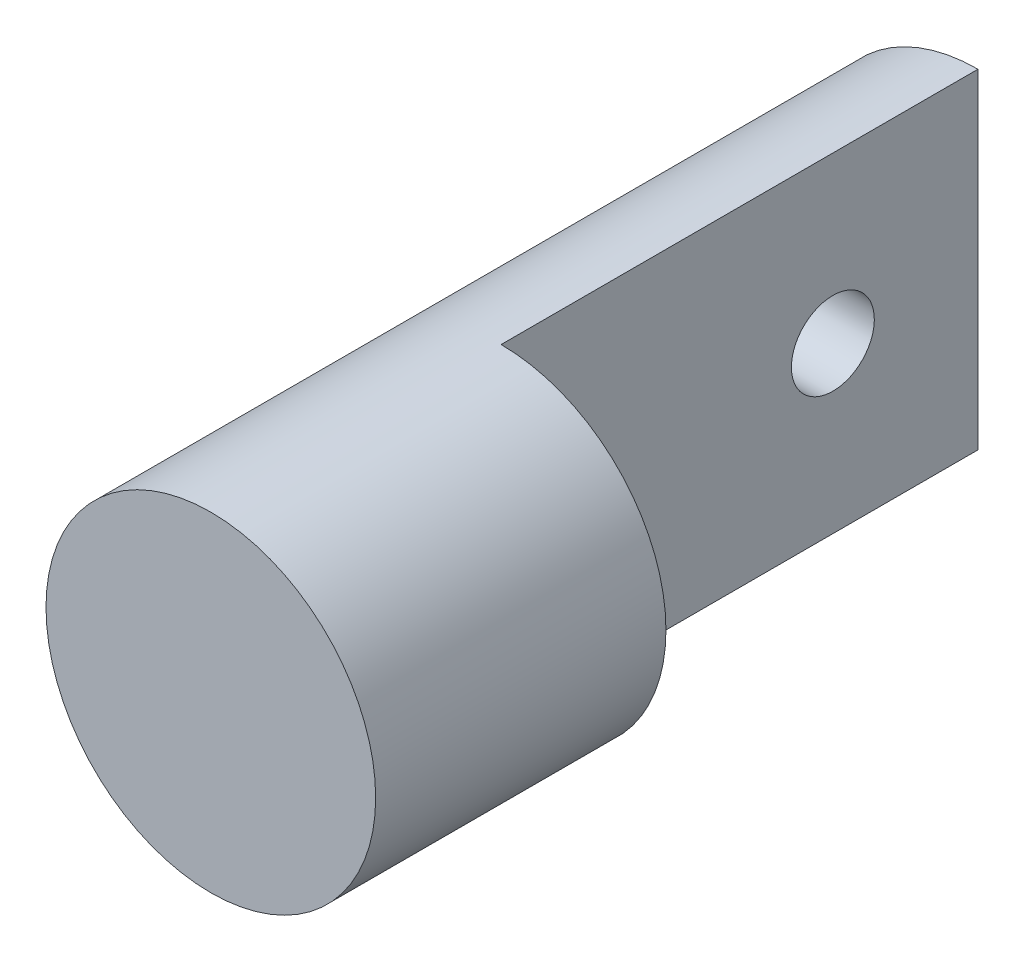
ISO-10303-21;
HEADER;
FILE_DESCRIPTION(('STEP AP214'),'2;1');
FILE_NAME('part.step','',(''),(''),'','','');
FILE_SCHEMA(('AUTOMOTIVE_DESIGN { 1 0 10303 214 1 1 1 1 }'));
ENDSEC;
DATA;
#1=APPLICATION_CONTEXT('core data for automotive mechanical design processes');
#2=APPLICATION_PROTOCOL_DEFINITION('international standard','automotive_design',2000,#1);
#3=PRODUCT_CONTEXT('',#1,'mechanical');
#4=PRODUCT('Part','Part','',(#3));
#5=PRODUCT_RELATED_PRODUCT_CATEGORY('part','',(#4));
#6=PRODUCT_DEFINITION_FORMATION('','',#4);
#7=PRODUCT_DEFINITION_CONTEXT('part definition',#1,'design');
#8=PRODUCT_DEFINITION('design','',#6,#7);
#9=PRODUCT_DEFINITION_SHAPE('','',#8);
#10=(LENGTH_UNIT() NAMED_UNIT(*) SI_UNIT(.MILLI.,.METRE.));
#11=(NAMED_UNIT(*) PLANE_ANGLE_UNIT() SI_UNIT($,.RADIAN.));
#12=(NAMED_UNIT(*) SI_UNIT($,.STERADIAN.) SOLID_ANGLE_UNIT());
#13=UNCERTAINTY_MEASURE_WITH_UNIT(LENGTH_MEASURE(1.E-05),#10,'distance_accuracy_value','');
#14=(GEOMETRIC_REPRESENTATION_CONTEXT(3) GLOBAL_UNCERTAINTY_ASSIGNED_CONTEXT((#13)) GLOBAL_UNIT_ASSIGNED_CONTEXT((#10,
#11,#12)) REPRESENTATION_CONTEXT('',''));
#15=CARTESIAN_POINT('',(0.,0.,0.));
#16=DIRECTION('',(0.,0.,1.));
#17=DIRECTION('',(1.,0.,0.));
#18=AXIS2_PLACEMENT_3D('',#15,#16,#17);
#19=CARTESIAN_POINT('',(0.,0.,30.));
#20=DIRECTION('',(0.,0.,-1.));
#21=DIRECTION('',(-1.,0.,0.));
#22=AXIS2_PLACEMENT_3D('',#19,#20,#21);
#23=CYLINDRICAL_SURFACE('',#22,7.95);
#24=CARTESIAN_POINT('',(0.,0.,40.));
#25=DIRECTION('',(0.,0.,1.));
#26=DIRECTION('',(1.,0.,0.));
#27=AXIS2_PLACEMENT_3D('',#24,#25,#26);
#28=CIRCLE('',#27,7.95);
#29=CARTESIAN_POINT('',(7.95,0.,40.));
#30=VERTEX_POINT('',#29);
#31=EDGE_CURVE('E54',#30,#30,#28,.T.);
#32=ORIENTED_EDGE('',*,*,#31,.F.);
#33=EDGE_LOOP('',(#32));
#34=FACE_BOUND('',#33,.T.);
#35=CARTESIAN_POINT('',(-7.95,0.,12.));
#36=CARTESIAN_POINT('',(-7.9499981473586,-0.110478777256117,11.9999969408006));
#37=CARTESIAN_POINT('',(-7.94767414587526,-0.220991592985561,11.990815044582));
#38=CARTESIAN_POINT('',(-7.93862848157117,-0.438848429292025,11.9543859843146));
#39=CARTESIAN_POINT('',(-7.93190436093982,-0.546190643796534,11.9271287236474));
#40=CARTESIAN_POINT('',(-7.914802826205,-0.754528897502054,11.8554799916162));
#41=CARTESIAN_POINT('',(-7.90442983044846,-0.855532438539045,11.8111092363873));
#42=CARTESIAN_POINT('',(-7.88113449384668,-1.04866265784741,11.7065662795258));
#43=CARTESIAN_POINT('',(-7.86821205916114,-1.14078900917948,11.6463934962218));
#44=CARTESIAN_POINT('',(-7.8409189966035,-1.31546922711321,11.5106303642999));
#45=CARTESIAN_POINT('',(-7.82652580038134,-1.39781179184715,11.4347726673729));
#46=CARTESIAN_POINT('',(-7.79806288700537,-1.54875033308904,11.2703653409984));
#47=CARTESIAN_POINT('',(-7.7839932069898,-1.61734473827474,11.1818142627643));
#48=CARTESIAN_POINT('',(-7.75754251106241,-1.7398369371588,10.992888918604));
#49=CARTESIAN_POINT('',(-7.74519012985949,-1.79349774424588,10.8923566255491));
#50=CARTESIAN_POINT('',(-7.7239019871856,-1.88307526475052,10.6833371617311));
#51=CARTESIAN_POINT('',(-7.71496567195264,-1.91899485438725,10.5748512836862));
#52=CARTESIAN_POINT('',(-7.70175351009803,-1.97134827595759,10.3553291754044));
#53=CARTESIAN_POINT('',(-7.69738686717122,-1.98816232705615,10.2443892151925));
#54=CARTESIAN_POINT('',(-7.69353672605309,-2.00301180419184,10.0211838546875));
#55=CARTESIAN_POINT('',(-7.69405242274576,-2.00105032638311,9.90891867597738));
#56=CARTESIAN_POINT('',(-7.69982710713575,-1.97870764686799,9.6891686400148));
#57=CARTESIAN_POINT('',(-7.70496925181981,-1.95878015931617,9.58163410136462));
#58=CARTESIAN_POINT('',(-7.71923115387767,-1.90179516936976,9.37148570877478));
#59=CARTESIAN_POINT('',(-7.7283511977998,-1.86473643291259,9.26887220991383));
#60=CARTESIAN_POINT('',(-7.74964812991638,-1.77415581600337,9.07026522247811));
#61=CARTESIAN_POINT('',(-7.76185526366622,-1.72046978722863,8.97434997821273));
#62=CARTESIAN_POINT('',(-7.78793393917011,-1.59827331033311,8.79272721659369));
#63=CARTESIAN_POINT('',(-7.8018057753581,-1.52976023804434,8.70702151034611));
#64=CARTESIAN_POINT('',(-7.83014230160794,-1.37750710674774,8.54565134693906));
#65=CARTESIAN_POINT('',(-7.84461254166528,-1.29338434095482,8.47034849071268));
#66=CARTESIAN_POINT('',(-7.87215426299764,-1.11353094821632,8.33484967024296));
#67=CARTESIAN_POINT('',(-7.88522570047111,-1.01779995797548,8.27465417898634));
#68=CARTESIAN_POINT('',(-7.90856342275351,-0.816927586688163,8.17094362505844));
#69=CARTESIAN_POINT('',(-7.91881969016959,-0.711754323621555,8.12748791291235));
#70=CARTESIAN_POINT('',(-7.93529866004501,-0.495279787787534,8.05897453565601));
#71=CARTESIAN_POINT('',(-7.94152214406784,-0.383979706951798,8.03391330552418));
#72=CARTESIAN_POINT('',(-7.94911843828687,-0.161502046632172,8.00345395223134));
#73=CARTESIAN_POINT('',(-7.95061267910018,-0.0503959218548927,7.99756347566663));
#74=CARTESIAN_POINT('',(-7.9489282830196,0.171214771333274,8.00426158994017));
#75=CARTESIAN_POINT('',(-7.94575007242964,0.281719393700633,8.01684849494362));
#76=CARTESIAN_POINT('',(-7.93515575535171,0.497275102973198,8.05973842089232));
#77=CARTESIAN_POINT('',(-7.92780407109567,0.60238319770014,8.08977228891141));
#78=CARTESIAN_POINT('',(-7.90969188745842,0.80606338153812,8.16639568572604));
#79=CARTESIAN_POINT('',(-7.89893104133798,0.904634804583204,8.21298689859564));
#80=CARTESIAN_POINT('',(-7.87490394021867,1.09439826095902,8.32235285641523));
#81=CARTESIAN_POINT('',(-7.86159624516764,1.18542640834542,8.38540263980588));
#82=CARTESIAN_POINT('',(-7.83401603048849,1.35578497578012,8.52554496461866));
#83=CARTESIAN_POINT('',(-7.81974334241115,1.43511334578629,8.60263996177437));
#84=CARTESIAN_POINT('',(-7.79140375736807,1.5818537015935,8.77097141062401));
#85=CARTESIAN_POINT('',(-7.7773508145004,1.64892011939754,8.8625119677205));
#86=CARTESIAN_POINT('',(-7.75143748754702,1.76673997437943,9.05583817603697));
#87=CARTESIAN_POINT('',(-7.73957700644768,1.81749413342733,9.15762337363675));
#88=CARTESIAN_POINT('',(-7.7195228238197,1.90087007085419,9.36800620330986));
#89=CARTESIAN_POINT('',(-7.71130746649744,1.93359922453502,9.4765591093103));
#90=CARTESIAN_POINT('',(-7.69945419542717,1.98027673799855,9.69786536253332));
#91=CARTESIAN_POINT('',(-7.69581526550424,1.99422926709372,9.81061777154821));
#92=CARTESIAN_POINT('',(-7.69360500906101,2.00273755897591,10.0336039749338));
#93=CARTESIAN_POINT('',(-7.69488930574386,1.99784591815241,10.1438155886006));
#94=CARTESIAN_POINT('',(-7.70204660126537,1.97007100621323,10.3617882893205));
#95=CARTESIAN_POINT('',(-7.70791950562335,1.94718810554244,10.4695494267826));
#96=CARTESIAN_POINT('',(-7.72351130757017,1.88438379581196,10.6789527144926));
#97=CARTESIAN_POINT('',(-7.73320650459007,1.84456726807462,10.7806282071079));
#98=CARTESIAN_POINT('',(-7.75535355215639,1.74910875753506,10.9759288298615));
#99=CARTESIAN_POINT('',(-7.76780578975192,1.69346455244042,11.06955282712));
#100=CARTESIAN_POINT('',(-7.79447454114762,1.56620309221131,11.2487601424652));
#101=CARTESIAN_POINT('',(-7.80872894848963,1.49420298496755,11.3340659888508));
#102=CARTESIAN_POINT('',(-7.83717108622478,1.33701797039181,11.491564543075));
#103=CARTESIAN_POINT('',(-7.85135879994863,1.25182993045417,11.5637541264533));
#104=CARTESIAN_POINT('',(-7.87838061334734,1.06879508180388,11.6942673177712));
#105=CARTESIAN_POINT('',(-7.89118499715308,0.97074416265602,11.7523112985977));
#106=CARTESIAN_POINT('',(-7.91368293273807,0.765962426262496,11.8509997130518));
#107=CARTESIAN_POINT('',(-7.92337869130117,0.659237834140899,11.891656496563));
#108=CARTESIAN_POINT('',(-7.93714990488377,0.460601705905531,11.9484481493641));
#109=CARTESIAN_POINT('',(-7.94193540762448,0.369628492851468,11.9677380260851));
#110=CARTESIAN_POINT('',(-7.94836111272679,0.185778111104452,11.9935147434956));
#111=CARTESIAN_POINT('',(-7.95000155787754,0.0929010899393575,12.0000025724665));
#112=CARTESIAN_POINT('',(-7.95,0.,12.));
#113=B_SPLINE_CURVE_WITH_KNOTS('',3,(#35,#36,#37,#38,#39,#40,#41,#42,#43,#44,#45,#46,#47,#48,
#49,#50,#51,#52,#53,#54,#55,#56,#57,#58,#59,#60,#61,#62,#63,#64,#65,#66,#67,#68,#69,#70,#71,#72,
#73,#74,#75,#76,#77,#78,#79,#80,#81,#82,#83,#84,#85,#86,#87,#88,#89,#90,#91,#92,#93,#94,#95,#96,
#97,#98,#99,#100,#101,#102,#103,#104,#105,#106,#107,#108,#109,#110,#111,#112),.UNSPECIFIED.,.T.,
.F.,(4,2,2,2,2,2,2,2,2,2,2,2,2,2,2,2,2,2,2,2,2,2,2,2,2,2,2,2,2,2,2,2,2,2,2,2,2,2,4),(0.,
0.331095861101427,0.662376823179075,0.993258017095689,1.32415139242971,1.66123452603796,
1.99835616404123,2.34055682849265,2.68270199689684,3.01791185916289,3.3530664450356,
3.67998705339147,4.00693121539324,4.33721186983802,4.6675510269621,5.0074331648634,
5.34732594258753,5.68841294839439,6.02943383090139,6.36162431036824,6.69378448340554,
7.02095162249386,7.34815204780474,7.6812157066694,8.01433765599364,8.35574732148008,
8.69714187640708,9.03648011143045,9.37574298462817,9.70513393561692,10.0345181045349,
10.3618912241058,10.6893103313601,11.0253719309388,11.361513479998,11.7038411048754,
12.0459251737382,12.3243636388486,12.6027806084665),.UNSPECIFIED.);
#114=CARTESIAN_POINT('',(-7.95,0.,12.));
#115=VERTEX_POINT('',#114);
#116=EDGE_CURVE('E87',#115,#115,#113,.T.);
#117=ORIENTED_EDGE('',*,*,#116,.T.);
#118=EDGE_LOOP('',(#117));
#119=FACE_BOUND('',#118,.T.);
#120=CARTESIAN_POINT('',(0.,0.,3.));
#121=DIRECTION('',(0.,0.,-1.));
#122=DIRECTION('',(-1.,0.,0.));
#123=AXIS2_PLACEMENT_3D('',#120,#121,#122);
#124=CIRCLE('',#123,7.95);
#125=CARTESIAN_POINT('',(0.,-7.95,3.));
#126=VERTEX_POINT('',#125);
#127=CARTESIAN_POINT('',(0.,7.95,3.00000000000001));
#128=VERTEX_POINT('',#127);
#129=EDGE_CURVE('E60',#126,#128,#124,.T.);
#130=ORIENTED_EDGE('',*,*,#129,.F.);
#131=DIRECTION('',(0.,0.,-1.));
#132=VECTOR('',#131,1.);
#133=CARTESIAN_POINT('',(0.,-7.95,26.));
#134=LINE('',#133,#132);
#135=CARTESIAN_POINT('',(0.,-7.95,26.));
#136=VERTEX_POINT('',#135);
#137=EDGE_CURVE('E80',#136,#126,#134,.T.);
#138=ORIENTED_EDGE('',*,*,#137,.F.);
#139=CARTESIAN_POINT('',(0.,0.,26.));
#140=DIRECTION('',(0.,0.,1.));
#141=DIRECTION('',(1.,0.,0.));
#142=AXIS2_PLACEMENT_3D('',#139,#140,#141);
#143=CIRCLE('',#142,7.95);
#144=CARTESIAN_POINT('',(0.,7.95,26.));
#145=VERTEX_POINT('',#144);
#146=EDGE_CURVE('E11',#136,#145,#143,.T.);
#147=ORIENTED_EDGE('',*,*,#146,.T.);
#148=DIRECTION('',(0.,0.,-1.));
#149=VECTOR('',#148,1.);
#150=CARTESIAN_POINT('',(0.,7.95,26.));
#151=LINE('',#150,#149);
#152=EDGE_CURVE('E81',#145,#128,#151,.T.);
#153=ORIENTED_EDGE('',*,*,#152,.T.);
#154=EDGE_LOOP('',(#130,#138,#147,#153));
#155=FACE_BOUND('',#154,.T.);
#156=ADVANCED_FACE('F45',(#34,#119,#155),#23,.T.);
#157=CARTESIAN_POINT('',(0.,7.95,26.));
#158=DIRECTION('',(1.,0.,0.));
#159=DIRECTION('',(0.,1.,0.));
#160=AXIS2_PLACEMENT_3D('',#157,#158,#159);
#161=PLANE('',#160);
#162=CARTESIAN_POINT('',(0.,0.,10.));
#163=DIRECTION('',(1.,0.,0.));
#164=DIRECTION('',(0.,1.,0.));
#165=AXIS2_PLACEMENT_3D('',#162,#163,#164);
#166=CIRCLE('',#165,2.);
#167=CARTESIAN_POINT('',(0.,2.,10.));
#168=VERTEX_POINT('',#167);
#169=EDGE_CURVE('E101',#168,#168,#166,.T.);
#170=ORIENTED_EDGE('',*,*,#169,.F.);
#171=EDGE_LOOP('',(#170));
#172=FACE_BOUND('',#171,.T.);
#173=ORIENTED_EDGE('',*,*,#137,.T.);
#174=DIRECTION('',(0.,-1.,0.));
#175=VECTOR('',#174,1.);
#176=CARTESIAN_POINT('',(0.,7.95,3.));
#177=LINE('',#176,#175);
#178=EDGE_CURVE('E70',#128,#126,#177,.T.);
#179=ORIENTED_EDGE('',*,*,#178,.F.);
#180=ORIENTED_EDGE('',*,*,#152,.F.);
#181=DIRECTION('',(0.,-1.,0.));
#182=VECTOR('',#181,1.);
#183=CARTESIAN_POINT('',(0.,7.95,26.));
#184=LINE('',#183,#182);
#185=EDGE_CURVE('E84',#145,#136,#184,.T.);
#186=ORIENTED_EDGE('',*,*,#185,.T.);
#187=EDGE_LOOP('',(#173,#179,#180,#186));
#188=FACE_BOUND('',#187,.T.);
#189=ADVANCED_FACE('F83',(#172,#188),#161,.T.);
#190=CARTESIAN_POINT('',(-3.95,0.,0.));
#191=DIRECTION('',(0.,0.,-1.));
#192=DIRECTION('',(-1.,0.,0.));
#193=AXIS2_PLACEMENT_3D('',#190,#191,#192);
#194=CYLINDRICAL_SURFACE('',#193,1.24999999999999);
#195=CARTESIAN_POINT('',(-5.19999999999999,0.,8.));
#196=CARTESIAN_POINT('',(-5.19999565000121,0.0635104730002022,8.00000404694687));
#197=CARTESIAN_POINT('',(-5.19512698818218,0.127096441053757,8.00305676688999));
#198=CARTESIAN_POINT('',(-5.17591419657049,0.252318262265281,8.01497832275898));
#199=CARTESIAN_POINT('',(-5.16155200607451,0.313950163299071,8.02385824425104));
#200=CARTESIAN_POINT('',(-5.12418863683794,0.43320555813678,8.04654147017865));
#201=CARTESIAN_POINT('',(-5.10123021215911,0.490847243665014,8.06032039221337));
#202=CARTESIAN_POINT('',(-5.04761414920324,0.601260368868357,8.09165401513927));
#203=CARTESIAN_POINT('',(-5.0169573639908,0.654032347276149,8.10920829764729));
#204=CARTESIAN_POINT('',(-4.94611342681502,0.757974192167969,8.14829847097727));
#205=CARTESIAN_POINT('',(-4.90536070002454,0.808679560769972,8.17004037775383));
#206=CARTESIAN_POINT('',(-4.81678082549344,0.902986375146754,8.21468650086368));
#207=CARTESIAN_POINT('',(-4.76894417174206,0.946578107215728,8.23759225141447));
#208=CARTESIAN_POINT('',(-4.65996610579548,1.03142873237132,8.28569581344801));
#209=CARTESIAN_POINT('',(-4.59790021339272,1.0715720602915,8.31078389006587));
#210=CARTESIAN_POINT('',(-4.46643518455281,1.14073966020039,8.35669801871268));
#211=CARTESIAN_POINT('',(-4.39704868742392,1.16978270899534,8.37753124003761));
#212=CARTESIAN_POINT('',(-4.27118947622128,1.2093340058598,8.40690424372635));
#213=CARTESIAN_POINT('',(-4.21603318146118,1.22269552371393,8.41723094009926));
#214=CARTESIAN_POINT('',(-4.1036940743892,1.24181843585479,8.43218642674194));
#215=CARTESIAN_POINT('',(-4.04651424172551,1.24759056342087,8.43682326326307));
#216=CARTESIAN_POINT('',(-3.93158698324888,1.25118918245719,8.43970114217172));
#217=CARTESIAN_POINT('',(-3.8738384635376,1.2489948372785,8.43792541228281));
#218=CARTESIAN_POINT('',(-3.75968989681104,1.23676317046803,8.4282259761608));
#219=CARTESIAN_POINT('',(-3.70329096796092,1.22671956265043,8.42029734232889));
#220=CARTESIAN_POINT('',(-3.59456154734252,1.19968103371473,8.39967426878219));
#221=CARTESIAN_POINT('',(-3.54216754431573,1.18285016736896,8.38709284895186));
#222=CARTESIAN_POINT('',(-3.44083881759458,1.14290189820937,8.35854433556593));
#223=CARTESIAN_POINT('',(-3.3919053251255,1.11978227193695,8.34257604498646));
#224=CARTESIAN_POINT('',(-3.28916672616726,1.06294892954948,8.3054518400698));
#225=CARTESIAN_POINT('',(-3.23615918987961,1.02806296601169,8.2838840842404));
#226=CARTESIAN_POINT('',(-3.13616972099952,0.950881463002093,8.23994288208756));
#227=CARTESIAN_POINT('',(-3.08919406829348,0.908578308011428,8.21756862664024));
#228=CARTESIAN_POINT('',(-2.99469825062961,0.809519713023322,8.17020105083143));
#229=CARTESIAN_POINT('',(-2.94836702574117,0.751531353595324,8.14538468323406));
#230=CARTESIAN_POINT('',(-2.86614910411275,0.627148099593561,8.09971944937555));
#231=CARTESIAN_POINT('',(-2.83025830227107,0.560756523881991,8.07886902485236));
#232=CARTESIAN_POINT('',(-2.77223631161858,0.424883562934741,8.04446627038683));
#233=CARTESIAN_POINT('',(-2.74946596001882,0.355763457732363,8.03058023408426));
#234=CARTESIAN_POINT('',(-2.71623507201719,0.213612154574969,8.01015070689951));
#235=CARTESIAN_POINT('',(-2.705757105778,0.140586648341299,8.0035968200993));
#236=CARTESIAN_POINT('',(-2.69843414993881,0.00451561874058414,7.99902159459909));
#237=CARTESIAN_POINT('',(-2.69979682204615,-0.0584027741637887,7.99987838654489));
#238=CARTESIAN_POINT('',(-2.71188282842073,-0.182972117996312,8.00741098505673));
#239=CARTESIAN_POINT('',(-2.72260552509217,-0.244623154962736,8.01408639526409));
#240=CARTESIAN_POINT('',(-2.75223853669197,-0.362521070658191,8.0322594771693));
#241=CARTESIAN_POINT('',(-2.77081215679666,-0.418885009953206,8.04355829473156));
#242=CARTESIAN_POINT('',(-2.81529638927857,-0.527638281070989,8.07004315895248));
#243=CARTESIAN_POINT('',(-2.84120823025516,-0.580026945470716,8.08522985649733));
#244=CARTESIAN_POINT('',(-2.90251520599549,-0.685084056277257,8.12009987643999));
#245=CARTESIAN_POINT('',(-2.93860356923824,-0.737246967843404,8.14008235182775));
#246=CARTESIAN_POINT('',(-3.01779386515282,-0.83514264021734,8.18193029998283));
#247=CARTESIAN_POINT('',(-3.06090358925455,-0.880868151291853,8.20379785173616));
#248=CARTESIAN_POINT('',(-3.16013503941266,-0.971474198022881,8.25094130286909));
#249=CARTESIAN_POINT('',(-3.21723720629479,-1.01526851939752,8.27625116585043));
#250=CARTESIAN_POINT('',(-3.33887578494426,-1.09280351885684,8.32433237251828));
#251=CARTESIAN_POINT('',(-3.403407006753,-1.12655115718693,8.34710546677663));
#252=CARTESIAN_POINT('',(-3.52469214805688,-1.17684772011827,8.38266469685408));
#253=CARTESIAN_POINT('',(-3.58024075073223,-1.19551895865479,8.3965436380622));
#254=CARTESIAN_POINT('',(-3.69439314576892,-1.22500108205244,8.41894969336232));
#255=CARTESIAN_POINT('',(-3.75299200945147,-1.23582424983126,8.42748516757394));
#256=CARTESIAN_POINT('',(-3.87209027688069,-1.24901383653653,8.43793675011268));
#257=CARTESIAN_POINT('',(-3.93259858548818,-1.25133186963292,8.43981498325431));
#258=CARTESIAN_POINT('',(-4.05313096036604,-1.24719778716817,8.43650936890152));
#259=CARTESIAN_POINT('',(-4.11315485900952,-1.24074275650142,8.43132317404413));
#260=CARTESIAN_POINT('',(-4.22602979505136,-1.22038272403399,8.41544611228665));
#261=CARTESIAN_POINT('',(-4.27906930141641,-1.20711919499769,8.40523191948939));
#262=CARTESIAN_POINT('',(-4.38213505958591,-1.17417623469512,8.38082469564309));
#263=CARTESIAN_POINT('',(-4.43216004453751,-1.15449412799406,8.36663000576272));
#264=CARTESIAN_POINT('',(-4.5355967438727,-1.10602690439617,8.33336097113481));
#265=CARTESIAN_POINT('',(-4.58845029847655,-1.07633644455459,8.31387769501002));
#266=CARTESIAN_POINT('',(-4.68893836724601,-1.01000017036388,8.27332293588131));
#267=CARTESIAN_POINT('',(-4.73656861256048,-0.973348732866932,8.25225017723174));
#268=CARTESIAN_POINT('',(-4.83501425497784,-0.885670221416051,8.20598089268818));
#269=CARTESIAN_POINT('',(-4.88459084544548,-0.833233674246786,8.18079458191223));
#270=CARTESIAN_POINT('',(-4.97449482970524,-0.719822446025195,8.13301270943252));
#271=CARTESIAN_POINT('',(-5.0148164959274,-0.658842515138541,8.11041875635605));
#272=CARTESIAN_POINT('',(-5.08477113012409,-0.529355399891399,8.07013289023451));
#273=CARTESIAN_POINT('',(-5.11438600540584,-0.460835727056562,8.05244928644643));
#274=CARTESIAN_POINT('',(-5.16107188433174,-0.318394712729492,8.02418478362157));
#275=CARTESIAN_POINT('',(-5.17818723486977,-0.244493501106843,8.01357878571311));
#276=CARTESIAN_POINT('',(-5.19229920916262,-0.141418481224659,8.00480527831857));
#277=CARTESIAN_POINT('',(-5.19518186533396,-0.113248608862866,8.00300827773698));
#278=CARTESIAN_POINT('',(-5.19903329153759,-0.0567241864870883,8.0006046978676));
#279=CARTESIAN_POINT('',(-5.20000194310999,-0.028369625151452,7.99999819226089));
#280=CARTESIAN_POINT('',(-5.19999999999999,0.,8.));
#281=B_SPLINE_CURVE_WITH_KNOTS('',3,(#195,#196,#197,#198,#199,#200,#201,#202,#203,#204,#205,
#206,#207,#208,#209,#210,#211,#212,#213,#214,#215,#216,#217,#218,#219,#220,#221,#222,#223,#224,
#225,#226,#227,#228,#229,#230,#231,#232,#233,#234,#235,#236,#237,#238,#239,#240,#241,#242,#243,
#244,#245,#246,#247,#248,#249,#250,#251,#252,#253,#254,#255,#256,#257,#258,#259,#260,#261,#262,
#263,#264,#265,#266,#267,#268,#269,#270,#271,#272,#273,#274,#275,#276,#277,#278,#279,#280),
.UNSPECIFIED.,.T.,.F.,(4,2,2,2,2,2,2,2,2,2,2,2,2,2,2,2,2,2,2,2,2,2,2,2,2,2,2,2,2,2,2,2,2,2,2,2,
2,2,2,2,2,2,4),(0.,0.190412301434131,0.38118789412846,0.571026987595133,0.760845054038791,
0.965821870536212,1.17107628325701,1.40412975852973,1.63678724607009,1.80912008879716,
1.9812089470739,2.15374823498777,2.32642584505082,2.49515839460435,2.66395067908032,
2.86427450354358,3.0648052257518,3.2984218069952,3.53194640727859,3.75284174135957,
3.97342347958129,4.16127180597571,4.34910733732278,4.52959504531296,4.71011298928464,
4.9088523099055,5.10781368827683,5.3356570886371,5.56334227196908,5.74329940313717,
5.92297427413349,6.10366974688197,6.2844252756386,6.45063169037737,6.61690747313439,
6.80725523036975,6.99775741153766,7.22600539035108,7.45439424578496,7.68316725607074,
7.91112460944403,7.99617501232476,8.08123067890583),.UNSPECIFIED.);
#282=CARTESIAN_POINT('',(-5.19999999999999,0.,8.));
#283=VERTEX_POINT('',#282);
#284=EDGE_CURVE('E103',#283,#283,#281,.T.);
#285=ORIENTED_EDGE('',*,*,#284,.F.);
#286=EDGE_LOOP('',(#285));
#287=FACE_BOUND('',#286,.T.);
#288=CARTESIAN_POINT('',(-3.95,0.,3.));
#289=DIRECTION('',(0.,0.,-1.));
#290=DIRECTION('',(-1.,0.,0.));
#291=AXIS2_PLACEMENT_3D('',#288,#289,#290);
#292=CIRCLE('',#291,1.24999999999999);
#293=CARTESIAN_POINT('',(-5.19999999999999,0.,3.));
#294=VERTEX_POINT('',#293);
#295=EDGE_CURVE('E49',#294,#294,#292,.F.);
#296=ORIENTED_EDGE('',*,*,#295,.F.);
#297=EDGE_LOOP('',(#296));
#298=FACE_BOUND('',#297,.T.);
#299=ADVANCED_FACE('F122',(#287,#298),#194,.F.);
#300=CARTESIAN_POINT('',(0.,0.,40.));
#301=DIRECTION('',(0.,0.,1.));
#302=DIRECTION('',(1.,0.,0.));
#303=AXIS2_PLACEMENT_3D('',#300,#301,#302);
#304=PLANE('',#303);
#305=ORIENTED_EDGE('',*,*,#31,.T.);
#306=EDGE_LOOP('',(#305));
#307=FACE_BOUND('',#306,.T.);
#308=ADVANCED_FACE('F94',(#307),#304,.T.);
#309=CARTESIAN_POINT('',(0.,0.,26.));
#310=DIRECTION('',(0.,0.,1.));
#311=DIRECTION('',(1.,0.,0.));
#312=AXIS2_PLACEMENT_3D('',#309,#310,#311);
#313=PLANE('',#312);
#314=ORIENTED_EDGE('',*,*,#146,.F.);
#315=ORIENTED_EDGE('',*,*,#185,.F.);
#316=EDGE_LOOP('',(#314,#315));
#317=FACE_BOUND('',#316,.T.);
#318=ADVANCED_FACE('F115',(#317),#313,.F.);
#319=CARTESIAN_POINT('',(-7.95,0.,10.));
#320=DIRECTION('',(1.,0.,0.));
#321=DIRECTION('',(0.,1.,0.));
#322=AXIS2_PLACEMENT_3D('',#319,#320,#321);
#323=CYLINDRICAL_SURFACE('',#322,2.);
#324=ORIENTED_EDGE('',*,*,#284,.T.);
#325=EDGE_LOOP('',(#324));
#326=FACE_BOUND('',#325,.T.);
#327=ORIENTED_EDGE('',*,*,#169,.T.);
#328=EDGE_LOOP('',(#327));
#329=FACE_BOUND('',#328,.T.);
#330=ORIENTED_EDGE('',*,*,#116,.F.);
#331=EDGE_LOOP('',(#330));
#332=FACE_BOUND('',#331,.T.);
#333=ADVANCED_FACE('F110',(#326,#329,#332),#323,.F.);
#334=CARTESIAN_POINT('',(0.,0.,3.));
#335=DIRECTION('',(0.,0.,-1.));
#336=DIRECTION('',(-1.,0.,0.));
#337=AXIS2_PLACEMENT_3D('',#334,#335,#336);
#338=PLANE('',#337);
#339=ORIENTED_EDGE('',*,*,#129,.T.);
#340=ORIENTED_EDGE('',*,*,#178,.T.);
#341=EDGE_LOOP('',(#339,#340));
#342=FACE_BOUND('',#341,.T.);
#343=ORIENTED_EDGE('',*,*,#295,.T.);
#344=EDGE_LOOP('',(#343));
#345=FACE_BOUND('',#344,.T.);
#346=ADVANCED_FACE('F71',(#342,#345),#338,.T.);
#347=CLOSED_SHELL('',(#156,#189,#299,#308,#318,#333,#346));
#348=MANIFOLD_SOLID_BREP('B2',#347);
#349=ADVANCED_BREP_SHAPE_REPRESENTATION('',(#18,#348),#14);
#350=SHAPE_DEFINITION_REPRESENTATION(#9,#349);
ENDSEC;
END-ISO-10303-21;
